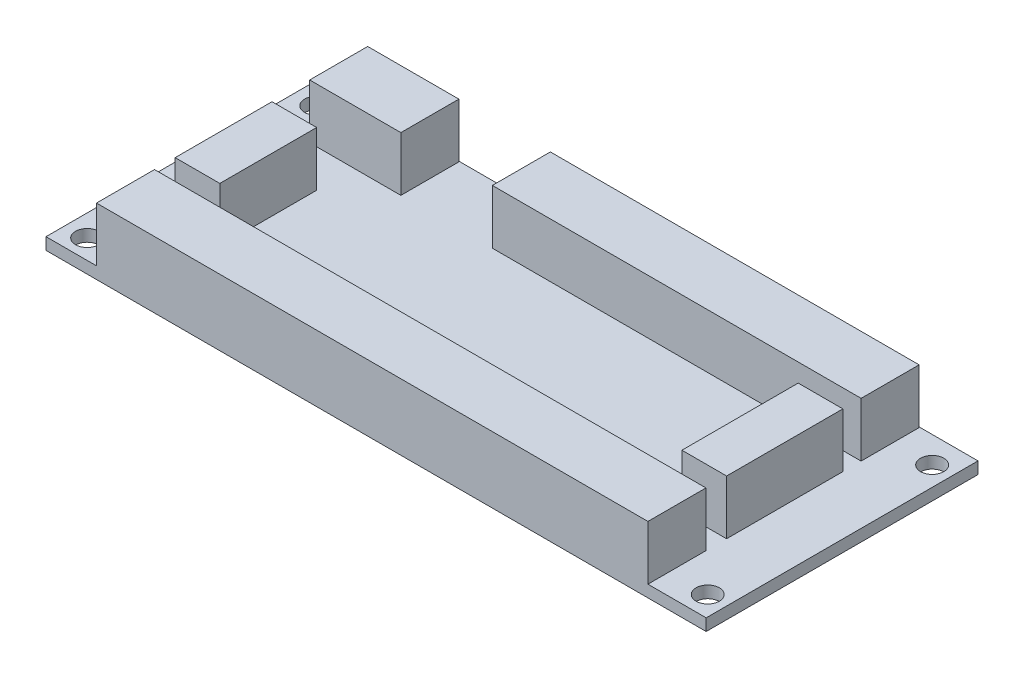
ISO-10303-21;
HEADER;
FILE_DESCRIPTION(('STEP AP214'),'2;1');
FILE_NAME('part.step','',(''),(''),'','','');
FILE_SCHEMA(('AUTOMOTIVE_DESIGN { 1 0 10303 214 1 1 1 1 }'));
ENDSEC;
DATA;
#1=APPLICATION_CONTEXT('core data for automotive mechanical design processes');
#2=APPLICATION_PROTOCOL_DEFINITION('international standard','automotive_design',2000,#1);
#3=PRODUCT_CONTEXT('',#1,'mechanical');
#4=PRODUCT('Part','Part','',(#3));
#5=PRODUCT_RELATED_PRODUCT_CATEGORY('part','',(#4));
#6=PRODUCT_DEFINITION_FORMATION('','',#4);
#7=PRODUCT_DEFINITION_CONTEXT('part definition',#1,'design');
#8=PRODUCT_DEFINITION('design','',#6,#7);
#9=PRODUCT_DEFINITION_SHAPE('','',#8);
#10=(LENGTH_UNIT() NAMED_UNIT(*) SI_UNIT(.MILLI.,.METRE.));
#11=(NAMED_UNIT(*) PLANE_ANGLE_UNIT() SI_UNIT($,.RADIAN.));
#12=(NAMED_UNIT(*) SI_UNIT($,.STERADIAN.) SOLID_ANGLE_UNIT());
#13=UNCERTAINTY_MEASURE_WITH_UNIT(LENGTH_MEASURE(1.E-05),#10,'distance_accuracy_value','');
#14=(GEOMETRIC_REPRESENTATION_CONTEXT(3) GLOBAL_UNCERTAINTY_ASSIGNED_CONTEXT((#13)) GLOBAL_UNIT_ASSIGNED_CONTEXT((#10,
#11,#12)) REPRESENTATION_CONTEXT('',''));
#15=CARTESIAN_POINT('',(0.,0.,0.));
#16=DIRECTION('',(0.,0.,1.));
#17=DIRECTION('',(1.,0.,0.));
#18=AXIS2_PLACEMENT_3D('',#15,#16,#17);
#19=CARTESIAN_POINT('',(0.,1.53,0.));
#20=DIRECTION('',(0.,-1.,0.));
#21=DIRECTION('',(0.,0.,-1.));
#22=AXIS2_PLACEMENT_3D('',#19,#20,#21);
#23=PLANE('',#22);
#24=DIRECTION('',(0.,0.,-1.));
#25=VECTOR('',#24,1.);
#26=CARTESIAN_POINT('',(-24.26,1.53,-17.42));
#27=LINE('',#26,#25);
#28=CARTESIAN_POINT('',(-24.26,1.53,-9.94999999999999));
#29=VERTEX_POINT('',#28);
#30=CARTESIAN_POINT('',(-24.26,1.53,-17.42));
#31=VERTEX_POINT('',#30);
#32=EDGE_CURVE('E216',#29,#31,#27,.T.);
#33=ORIENTED_EDGE('',*,*,#32,.F.);
#34=DIRECTION('',(1.,0.,0.));
#35=VECTOR('',#34,1.);
#36=CARTESIAN_POINT('',(-24.26,1.53,-9.94999999999999));
#37=LINE('',#36,#35);
#38=CARTESIAN_POINT('',(-36.,1.53,-9.94999999999999));
#39=VERTEX_POINT('',#38);
#40=EDGE_CURVE('E229',#39,#29,#37,.T.);
#41=ORIENTED_EDGE('',*,*,#40,.F.);
#42=DIRECTION('',(0.,0.,1.));
#43=VECTOR('',#42,1.);
#44=CARTESIAN_POINT('',(-36.,1.53,-17.42));
#45=LINE('',#44,#43);
#46=CARTESIAN_POINT('',(-36.,1.53,-17.42));
#47=VERTEX_POINT('',#46);
#48=EDGE_CURVE('E238',#47,#39,#45,.T.);
#49=ORIENTED_EDGE('',*,*,#48,.F.);
#50=DIRECTION('',(-1.,0.,0.));
#51=VECTOR('',#50,1.);
#52=CARTESIAN_POINT('',(-24.26,1.53,-17.42));
#53=LINE('',#52,#51);
#54=EDGE_CURVE('E219',#31,#47,#53,.T.);
#55=ORIENTED_EDGE('',*,*,#54,.F.);
#56=EDGE_LOOP('',(#33,#41,#49,#55));
#57=FACE_BOUND('',#56,.T.);
#58=DIRECTION('',(0.,0.,-1.));
#59=VECTOR('',#58,1.);
#60=CARTESIAN_POINT('',(35.,1.53,-17.42));
#61=LINE('',#60,#59);
#62=CARTESIAN_POINT('',(35.,1.53,-9.95));
#63=VERTEX_POINT('',#62);
#64=CARTESIAN_POINT('',(35.,1.53,-17.42));
#65=VERTEX_POINT('',#64);
#66=EDGE_CURVE('E287',#63,#65,#61,.T.);
#67=ORIENTED_EDGE('',*,*,#66,.F.);
#68=DIRECTION('',(1.,0.,0.));
#69=VECTOR('',#68,1.);
#70=CARTESIAN_POINT('',(35.,1.53,-9.95));
#71=LINE('',#70,#69);
#72=CARTESIAN_POINT('',(-12.48,1.53,-9.94999999999999));
#73=VERTEX_POINT('',#72);
#74=EDGE_CURVE('E292',#73,#63,#71,.T.);
#75=ORIENTED_EDGE('',*,*,#74,.F.);
#76=DIRECTION('',(0.,0.,1.));
#77=VECTOR('',#76,1.);
#78=CARTESIAN_POINT('',(-12.48,1.53,-17.42));
#79=LINE('',#78,#77);
#80=CARTESIAN_POINT('',(-12.48,1.53,-17.42));
#81=VERTEX_POINT('',#80);
#82=EDGE_CURVE('E304',#81,#73,#79,.T.);
#83=ORIENTED_EDGE('',*,*,#82,.F.);
#84=DIRECTION('',(-1.,0.,0.));
#85=VECTOR('',#84,1.);
#86=CARTESIAN_POINT('',(35.,1.53,-17.42));
#87=LINE('',#86,#85);
#88=EDGE_CURVE('E301',#65,#81,#87,.T.);
#89=ORIENTED_EDGE('',*,*,#88,.F.);
#90=EDGE_LOOP('',(#67,#75,#83,#89));
#91=FACE_BOUND('',#90,.T.);
#92=CARTESIAN_POINT('',(40.,1.53,14.8));
#93=DIRECTION('',(0.,1.,0.));
#94=DIRECTION('',(0.,0.,1.));
#95=AXIS2_PLACEMENT_3D('',#92,#93,#94);
#96=CIRCLE('',#95,1.5);
#97=CARTESIAN_POINT('',(40.,1.53,16.3));
#98=VERTEX_POINT('',#97);
#99=EDGE_CURVE('E351',#98,#98,#96,.T.);
#100=ORIENTED_EDGE('',*,*,#99,.F.);
#101=EDGE_LOOP('',(#100));
#102=FACE_BOUND('',#101,.T.);
#103=CARTESIAN_POINT('',(40.,1.53,-14.1));
#104=DIRECTION('',(0.,1.,0.));
#105=DIRECTION('',(0.,0.,1.));
#106=AXIS2_PLACEMENT_3D('',#103,#104,#105);
#107=CIRCLE('',#106,1.5);
#108=CARTESIAN_POINT('',(40.,1.53,-12.6));
#109=VERTEX_POINT('',#108);
#110=EDGE_CURVE('E357',#109,#109,#107,.T.);
#111=ORIENTED_EDGE('',*,*,#110,.F.);
#112=EDGE_LOOP('',(#111));
#113=FACE_BOUND('',#112,.T.);
#114=CARTESIAN_POINT('',(-39.7,1.53,15.));
#115=DIRECTION('',(0.,1.,0.));
#116=DIRECTION('',(0.,0.,1.));
#117=AXIS2_PLACEMENT_3D('',#114,#115,#116);
#118=CIRCLE('',#117,1.5);
#119=CARTESIAN_POINT('',(-39.7,1.53,16.5));
#120=VERTEX_POINT('',#119);
#121=EDGE_CURVE('E363',#120,#120,#118,.T.);
#122=ORIENTED_EDGE('',*,*,#121,.F.);
#123=EDGE_LOOP('',(#122));
#124=FACE_BOUND('',#123,.T.);
#125=CARTESIAN_POINT('',(-39.7,1.53,-14.5));
#126=DIRECTION('',(0.,1.,0.));
#127=DIRECTION('',(0.,0.,1.));
#128=AXIS2_PLACEMENT_3D('',#125,#126,#127);
#129=CIRCLE('',#128,1.5);
#130=CARTESIAN_POINT('',(-39.7,1.53,-13.));
#131=VERTEX_POINT('',#130);
#132=EDGE_CURVE('E369',#131,#131,#129,.T.);
#133=ORIENTED_EDGE('',*,*,#132,.F.);
#134=EDGE_LOOP('',(#133));
#135=FACE_BOUND('',#134,.T.);
#136=DIRECTION('',(0.,0.,1.));
#137=VECTOR('',#136,1.);
#138=CARTESIAN_POINT('',(-36.,1.53,17.5));
#139=LINE('',#138,#137);
#140=CARTESIAN_POINT('',(-36.,1.53,10.03));
#141=VERTEX_POINT('',#140);
#142=CARTESIAN_POINT('',(-36.,1.53,17.5));
#143=VERTEX_POINT('',#142);
#144=EDGE_CURVE('E320',#141,#143,#139,.T.);
#145=ORIENTED_EDGE('',*,*,#144,.F.);
#146=DIRECTION('',(-1.,0.,0.));
#147=VECTOR('',#146,1.);
#148=CARTESIAN_POINT('',(-36.,1.53,10.03));
#149=LINE('',#148,#147);
#150=CARTESIAN_POINT('',(35.,1.53,10.03));
#151=VERTEX_POINT('',#150);
#152=EDGE_CURVE('E325',#151,#141,#149,.T.);
#153=ORIENTED_EDGE('',*,*,#152,.F.);
#154=DIRECTION('',(0.,0.,-1.));
#155=VECTOR('',#154,1.);
#156=CARTESIAN_POINT('',(35.,1.53,17.5));
#157=LINE('',#156,#155);
#158=CARTESIAN_POINT('',(35.,1.53,17.5));
#159=VERTEX_POINT('',#158);
#160=EDGE_CURVE('E334',#159,#151,#157,.T.);
#161=ORIENTED_EDGE('',*,*,#160,.F.);
#162=DIRECTION('',(1.,0.,0.));
#163=VECTOR('',#162,1.);
#164=CARTESIAN_POINT('',(-42.5,1.53,17.5));
#165=LINE('',#164,#163);
#166=CARTESIAN_POINT('',(42.5,1.53,17.5));
#167=VERTEX_POINT('',#166);
#168=EDGE_CURVE('E383',#159,#167,#165,.T.);
#169=ORIENTED_EDGE('',*,*,#168,.T.);
#170=DIRECTION('',(0.,0.,-1.));
#171=VECTOR('',#170,1.);
#172=CARTESIAN_POINT('',(42.5,1.53,17.5));
#173=LINE('',#172,#171);
#174=CARTESIAN_POINT('',(42.5,1.53,-17.5));
#175=VERTEX_POINT('',#174);
#176=EDGE_CURVE('E375',#167,#175,#173,.T.);
#177=ORIENTED_EDGE('',*,*,#176,.T.);
#178=DIRECTION('',(-1.,0.,0.));
#179=VECTOR('',#178,1.);
#180=CARTESIAN_POINT('',(-42.5,1.53,-17.5));
#181=LINE('',#180,#179);
#182=CARTESIAN_POINT('',(-42.5,1.53,-17.5));
#183=VERTEX_POINT('',#182);
#184=EDGE_CURVE('E378',#175,#183,#181,.T.);
#185=ORIENTED_EDGE('',*,*,#184,.T.);
#186=DIRECTION('',(0.,0.,1.));
#187=VECTOR('',#186,1.);
#188=CARTESIAN_POINT('',(-42.5,1.53,17.5));
#189=LINE('',#188,#187);
#190=CARTESIAN_POINT('',(-42.5,1.53,17.5));
#191=VERTEX_POINT('',#190);
#192=EDGE_CURVE('E381',#183,#191,#189,.T.);
#193=ORIENTED_EDGE('',*,*,#192,.T.);
#194=EDGE_CURVE('E384',#191,#143,#165,.T.);
#195=ORIENTED_EDGE('',*,*,#194,.T.);
#196=EDGE_LOOP('',(#145,#153,#161,#169,#177,#185,#193,#195));
#197=FACE_BOUND('',#196,.T.);
#198=DIRECTION('',(0.,0.,-1.));
#199=VECTOR('',#198,1.);
#200=CARTESIAN_POINT('',(35.,1.53,7.37));
#201=LINE('',#200,#199);
#202=CARTESIAN_POINT('',(35.,1.53,7.37));
#203=VERTEX_POINT('',#202);
#204=CARTESIAN_POINT('',(35.,1.53,-7.6));
#205=VERTEX_POINT('',#204);
#206=EDGE_CURVE('E254',#203,#205,#201,.T.);
#207=ORIENTED_EDGE('',*,*,#206,.F.);
#208=DIRECTION('',(1.,0.,0.));
#209=VECTOR('',#208,1.);
#210=CARTESIAN_POINT('',(35.,1.53,7.37));
#211=LINE('',#210,#209);
#212=CARTESIAN_POINT('',(29.25,1.53,7.37));
#213=VERTEX_POINT('',#212);
#214=EDGE_CURVE('E259',#213,#203,#211,.T.);
#215=ORIENTED_EDGE('',*,*,#214,.F.);
#216=DIRECTION('',(0.,0.,1.));
#217=VECTOR('',#216,1.);
#218=CARTESIAN_POINT('',(29.25,1.53,7.37));
#219=LINE('',#218,#217);
#220=CARTESIAN_POINT('',(29.25,1.53,-7.6));
#221=VERTEX_POINT('',#220);
#222=EDGE_CURVE('E271',#221,#213,#219,.T.);
#223=ORIENTED_EDGE('',*,*,#222,.F.);
#224=DIRECTION('',(-1.,0.,0.));
#225=VECTOR('',#224,1.);
#226=CARTESIAN_POINT('',(35.,1.53,-7.6));
#227=LINE('',#226,#225);
#228=EDGE_CURVE('E268',#205,#221,#227,.T.);
#229=ORIENTED_EDGE('',*,*,#228,.F.);
#230=EDGE_LOOP('',(#207,#215,#223,#229));
#231=FACE_BOUND('',#230,.T.);
#232=DIRECTION('',(0.,0.,1.));
#233=VECTOR('',#232,1.);
#234=CARTESIAN_POINT('',(-36.,1.53,7.37));
#235=LINE('',#234,#233);
#236=CARTESIAN_POINT('',(-36.,1.53,-5.1));
#237=VERTEX_POINT('',#236);
#238=CARTESIAN_POINT('',(-36.,1.53,7.37));
#239=VERTEX_POINT('',#238);
#240=EDGE_CURVE('E215',#237,#239,#235,.T.);
#241=ORIENTED_EDGE('',*,*,#240,.F.);
#242=DIRECTION('',(-1.,0.,0.));
#243=VECTOR('',#242,1.);
#244=CARTESIAN_POINT('',(-36.,1.53,-5.1));
#245=LINE('',#244,#243);
#246=CARTESIAN_POINT('',(-30.25,1.53,-5.1));
#247=VERTEX_POINT('',#246);
#248=EDGE_CURVE('E212',#247,#237,#245,.T.);
#249=ORIENTED_EDGE('',*,*,#248,.F.);
#250=DIRECTION('',(0.,0.,-1.));
#251=VECTOR('',#250,1.);
#252=CARTESIAN_POINT('',(-30.25,1.53,7.37));
#253=LINE('',#252,#251);
#254=CARTESIAN_POINT('',(-30.25,1.53,7.37));
#255=VERTEX_POINT('',#254);
#256=EDGE_CURVE('E54',#255,#247,#253,.T.);
#257=ORIENTED_EDGE('',*,*,#256,.F.);
#258=DIRECTION('',(1.,0.,0.));
#259=VECTOR('',#258,1.);
#260=CARTESIAN_POINT('',(-36.,1.53,7.37));
#261=LINE('',#260,#259);
#262=EDGE_CURVE('E49',#239,#255,#261,.T.);
#263=ORIENTED_EDGE('',*,*,#262,.F.);
#264=EDGE_LOOP('',(#241,#249,#257,#263));
#265=FACE_BOUND('',#264,.T.);
#266=ADVANCED_FACE('F34',(#57,#91,#102,#113,#124,#135,#197,#231,#265),#23,.F.);
#267=CARTESIAN_POINT('',(0.,0.,0.));
#268=DIRECTION('',(0.,-1.,0.));
#269=DIRECTION('',(0.,0.,-1.));
#270=AXIS2_PLACEMENT_3D('',#267,#268,#269);
#271=PLANE('',#270);
#272=CARTESIAN_POINT('',(40.,0.,-14.1));
#273=DIRECTION('',(0.,1.,0.));
#274=DIRECTION('',(0.,0.,1.));
#275=AXIS2_PLACEMENT_3D('',#272,#273,#274);
#276=CIRCLE('',#275,1.5);
#277=CARTESIAN_POINT('',(40.,0.,-12.6));
#278=VERTEX_POINT('',#277);
#279=EDGE_CURVE('E354',#278,#278,#276,.T.);
#280=ORIENTED_EDGE('',*,*,#279,.T.);
#281=EDGE_LOOP('',(#280));
#282=FACE_BOUND('',#281,.T.);
#283=CARTESIAN_POINT('',(-39.7,0.,-14.5));
#284=DIRECTION('',(0.,1.,0.));
#285=DIRECTION('',(0.,0.,1.));
#286=AXIS2_PLACEMENT_3D('',#283,#284,#285);
#287=CIRCLE('',#286,1.5);
#288=CARTESIAN_POINT('',(-39.7,0.,-13.));
#289=VERTEX_POINT('',#288);
#290=EDGE_CURVE('E366',#289,#289,#287,.T.);
#291=ORIENTED_EDGE('',*,*,#290,.T.);
#292=EDGE_LOOP('',(#291));
#293=FACE_BOUND('',#292,.T.);
#294=DIRECTION('',(0.,0.,-1.));
#295=VECTOR('',#294,1.);
#296=CARTESIAN_POINT('',(42.5,0.,17.5));
#297=LINE('',#296,#295);
#298=CARTESIAN_POINT('',(42.5,0.,17.5));
#299=VERTEX_POINT('',#298);
#300=CARTESIAN_POINT('',(42.5,0.,-17.5));
#301=VERTEX_POINT('',#300);
#302=EDGE_CURVE('E372',#299,#301,#297,.T.);
#303=ORIENTED_EDGE('',*,*,#302,.F.);
#304=DIRECTION('',(1.,0.,0.));
#305=VECTOR('',#304,1.);
#306=CARTESIAN_POINT('',(-42.5,0.,17.5));
#307=LINE('',#306,#305);
#308=CARTESIAN_POINT('',(-42.5,0.,17.5));
#309=VERTEX_POINT('',#308);
#310=EDGE_CURVE('E379',#309,#299,#307,.T.);
#311=ORIENTED_EDGE('',*,*,#310,.F.);
#312=DIRECTION('',(0.,0.,1.));
#313=VECTOR('',#312,1.);
#314=CARTESIAN_POINT('',(-42.5,0.,17.5));
#315=LINE('',#314,#313);
#316=CARTESIAN_POINT('',(-42.5,0.,-17.5));
#317=VERTEX_POINT('',#316);
#318=EDGE_CURVE('E391',#317,#309,#315,.T.);
#319=ORIENTED_EDGE('',*,*,#318,.F.);
#320=DIRECTION('',(-1.,0.,0.));
#321=VECTOR('',#320,1.);
#322=CARTESIAN_POINT('',(-42.5,0.,-17.5));
#323=LINE('',#322,#321);
#324=EDGE_CURVE('E389',#301,#317,#323,.T.);
#325=ORIENTED_EDGE('',*,*,#324,.F.);
#326=EDGE_LOOP('',(#303,#311,#319,#325));
#327=FACE_BOUND('',#326,.T.);
#328=CARTESIAN_POINT('',(-39.7,0.,15.));
#329=DIRECTION('',(0.,1.,0.));
#330=DIRECTION('',(0.,0.,1.));
#331=AXIS2_PLACEMENT_3D('',#328,#329,#330);
#332=CIRCLE('',#331,1.5);
#333=CARTESIAN_POINT('',(-39.7,0.,16.5));
#334=VERTEX_POINT('',#333);
#335=EDGE_CURVE('E360',#334,#334,#332,.T.);
#336=ORIENTED_EDGE('',*,*,#335,.T.);
#337=EDGE_LOOP('',(#336));
#338=FACE_BOUND('',#337,.T.);
#339=CARTESIAN_POINT('',(40.,0.,14.8));
#340=DIRECTION('',(0.,1.,0.));
#341=DIRECTION('',(0.,0.,1.));
#342=AXIS2_PLACEMENT_3D('',#339,#340,#341);
#343=CIRCLE('',#342,1.5);
#344=CARTESIAN_POINT('',(40.,0.,16.3));
#345=VERTEX_POINT('',#344);
#346=EDGE_CURVE('E350',#345,#345,#343,.T.);
#347=ORIENTED_EDGE('',*,*,#346,.T.);
#348=EDGE_LOOP('',(#347));
#349=FACE_BOUND('',#348,.T.);
#350=ADVANCED_FACE('F409',(#282,#293,#327,#338,#349),#271,.T.);
#351=CARTESIAN_POINT('',(42.5,1.53,17.5));
#352=DIRECTION('',(-1.,0.,0.));
#353=DIRECTION('',(0.,0.,1.));
#354=AXIS2_PLACEMENT_3D('',#351,#352,#353);
#355=PLANE('',#354);
#356=ORIENTED_EDGE('',*,*,#302,.T.);
#357=DIRECTION('',(0.,-1.,0.));
#358=VECTOR('',#357,1.);
#359=CARTESIAN_POINT('',(42.5,1.53,-17.5));
#360=LINE('',#359,#358);
#361=EDGE_CURVE('E11',#175,#301,#360,.T.);
#362=ORIENTED_EDGE('',*,*,#361,.F.);
#363=ORIENTED_EDGE('',*,*,#176,.F.);
#364=DIRECTION('',(0.,-1.,0.));
#365=VECTOR('',#364,1.);
#366=CARTESIAN_POINT('',(42.5,1.53,17.5));
#367=LINE('',#366,#365);
#368=EDGE_CURVE('E386',#167,#299,#367,.T.);
#369=ORIENTED_EDGE('',*,*,#368,.T.);
#370=EDGE_LOOP('',(#356,#362,#363,#369));
#371=FACE_BOUND('',#370,.T.);
#372=ADVANCED_FACE('F36',(#371),#355,.F.);
#373=CARTESIAN_POINT('',(-42.5,1.53,-17.5));
#374=DIRECTION('',(0.,0.,1.));
#375=DIRECTION('',(1.,0.,0.));
#376=AXIS2_PLACEMENT_3D('',#373,#374,#375);
#377=PLANE('',#376);
#378=ORIENTED_EDGE('',*,*,#324,.T.);
#379=DIRECTION('',(0.,-1.,0.));
#380=VECTOR('',#379,1.);
#381=CARTESIAN_POINT('',(-42.5,1.53,-17.5));
#382=LINE('',#381,#380);
#383=EDGE_CURVE('E42',#183,#317,#382,.T.);
#384=ORIENTED_EDGE('',*,*,#383,.F.);
#385=ORIENTED_EDGE('',*,*,#184,.F.);
#386=ORIENTED_EDGE('',*,*,#361,.T.);
#387=EDGE_LOOP('',(#378,#384,#385,#386));
#388=FACE_BOUND('',#387,.T.);
#389=ADVANCED_FACE('F461',(#388),#377,.F.);
#390=CARTESIAN_POINT('',(-42.5,1.53,17.5));
#391=DIRECTION('',(1.,0.,0.));
#392=DIRECTION('',(0.,0.,-1.));
#393=AXIS2_PLACEMENT_3D('',#390,#391,#392);
#394=PLANE('',#393);
#395=ORIENTED_EDGE('',*,*,#318,.T.);
#396=DIRECTION('',(0.,-1.,0.));
#397=VECTOR('',#396,1.);
#398=CARTESIAN_POINT('',(-42.5,1.53,17.5));
#399=LINE('',#398,#397);
#400=EDGE_CURVE('E396',#191,#309,#399,.T.);
#401=ORIENTED_EDGE('',*,*,#400,.F.);
#402=ORIENTED_EDGE('',*,*,#192,.F.);
#403=ORIENTED_EDGE('',*,*,#383,.T.);
#404=EDGE_LOOP('',(#395,#401,#402,#403));
#405=FACE_BOUND('',#404,.T.);
#406=ADVANCED_FACE('F403',(#405),#394,.F.);
#407=CARTESIAN_POINT('',(-42.5,1.53,17.5));
#408=DIRECTION('',(0.,0.,-1.));
#409=DIRECTION('',(-1.,0.,0.));
#410=AXIS2_PLACEMENT_3D('',#407,#408,#409);
#411=PLANE('',#410);
#412=ORIENTED_EDGE('',*,*,#310,.T.);
#413=ORIENTED_EDGE('',*,*,#368,.F.);
#414=ORIENTED_EDGE('',*,*,#168,.F.);
#415=DIRECTION('',(0.,-1.,0.));
#416=VECTOR('',#415,1.);
#417=CARTESIAN_POINT('',(35.,8.53,17.5));
#418=LINE('',#417,#416);
#419=CARTESIAN_POINT('',(35.,8.53,17.5));
#420=VERTEX_POINT('',#419);
#421=EDGE_CURVE('E344',#420,#159,#418,.T.);
#422=ORIENTED_EDGE('',*,*,#421,.F.);
#423=DIRECTION('',(1.,0.,0.));
#424=VECTOR('',#423,1.);
#425=CARTESIAN_POINT('',(-36.,8.53,17.5));
#426=LINE('',#425,#424);
#427=CARTESIAN_POINT('',(-36.,8.53,17.5));
#428=VERTEX_POINT('',#427);
#429=EDGE_CURVE('E324',#428,#420,#426,.T.);
#430=ORIENTED_EDGE('',*,*,#429,.F.);
#431=DIRECTION('',(0.,-1.,0.));
#432=VECTOR('',#431,1.);
#433=CARTESIAN_POINT('',(-36.,8.53,17.5));
#434=LINE('',#433,#432);
#435=EDGE_CURVE('E347',#428,#143,#434,.T.);
#436=ORIENTED_EDGE('',*,*,#435,.T.);
#437=ORIENTED_EDGE('',*,*,#194,.F.);
#438=ORIENTED_EDGE('',*,*,#400,.T.);
#439=EDGE_LOOP('',(#412,#413,#414,#422,#430,#436,#437,#438));
#440=FACE_BOUND('',#439,.T.);
#441=ADVANCED_FACE('F413',(#440),#411,.F.);
#442=CARTESIAN_POINT('',(-39.7,1.53,-14.5));
#443=DIRECTION('',(0.,-1.,0.));
#444=DIRECTION('',(0.,0.,-1.));
#445=AXIS2_PLACEMENT_3D('',#442,#443,#444);
#446=CYLINDRICAL_SURFACE('',#445,1.5);
#447=ORIENTED_EDGE('',*,*,#132,.T.);
#448=EDGE_LOOP('',(#447));
#449=FACE_BOUND('',#448,.T.);
#450=ORIENTED_EDGE('',*,*,#290,.F.);
#451=EDGE_LOOP('',(#450));
#452=FACE_BOUND('',#451,.T.);
#453=ADVANCED_FACE('F455',(#449,#452),#446,.F.);
#454=CARTESIAN_POINT('',(-39.7,1.53,15.));
#455=DIRECTION('',(0.,-1.,0.));
#456=DIRECTION('',(0.,0.,-1.));
#457=AXIS2_PLACEMENT_3D('',#454,#455,#456);
#458=CYLINDRICAL_SURFACE('',#457,1.5);
#459=ORIENTED_EDGE('',*,*,#121,.T.);
#460=EDGE_LOOP('',(#459));
#461=FACE_BOUND('',#460,.T.);
#462=ORIENTED_EDGE('',*,*,#335,.F.);
#463=EDGE_LOOP('',(#462));
#464=FACE_BOUND('',#463,.T.);
#465=ADVANCED_FACE('F502',(#461,#464),#458,.F.);
#466=CARTESIAN_POINT('',(40.,1.53,-14.1));
#467=DIRECTION('',(0.,-1.,0.));
#468=DIRECTION('',(0.,0.,-1.));
#469=AXIS2_PLACEMENT_3D('',#466,#467,#468);
#470=CYLINDRICAL_SURFACE('',#469,1.5);
#471=ORIENTED_EDGE('',*,*,#110,.T.);
#472=EDGE_LOOP('',(#471));
#473=FACE_BOUND('',#472,.T.);
#474=ORIENTED_EDGE('',*,*,#279,.F.);
#475=EDGE_LOOP('',(#474));
#476=FACE_BOUND('',#475,.T.);
#477=ADVANCED_FACE('F510',(#473,#476),#470,.F.);
#478=CARTESIAN_POINT('',(40.,1.53,14.8));
#479=DIRECTION('',(0.,-1.,0.));
#480=DIRECTION('',(0.,0.,-1.));
#481=AXIS2_PLACEMENT_3D('',#478,#479,#480);
#482=CYLINDRICAL_SURFACE('',#481,1.5);
#483=ORIENTED_EDGE('',*,*,#99,.T.);
#484=EDGE_LOOP('',(#483));
#485=FACE_BOUND('',#484,.T.);
#486=ORIENTED_EDGE('',*,*,#346,.F.);
#487=EDGE_LOOP('',(#486));
#488=FACE_BOUND('',#487,.T.);
#489=ADVANCED_FACE('F518',(#485,#488),#482,.F.);
#490=CARTESIAN_POINT('',(-36.,8.53,17.5));
#491=DIRECTION('',(1.,0.,0.));
#492=DIRECTION('',(0.,0.,-1.));
#493=AXIS2_PLACEMENT_3D('',#490,#491,#492);
#494=PLANE('',#493);
#495=ORIENTED_EDGE('',*,*,#144,.T.);
#496=ORIENTED_EDGE('',*,*,#435,.F.);
#497=DIRECTION('',(0.,0.,1.));
#498=VECTOR('',#497,1.);
#499=CARTESIAN_POINT('',(-36.,8.53,17.5));
#500=LINE('',#499,#498);
#501=CARTESIAN_POINT('',(-36.,8.53,10.03));
#502=VERTEX_POINT('',#501);
#503=EDGE_CURVE('E321',#502,#428,#500,.T.);
#504=ORIENTED_EDGE('',*,*,#503,.F.);
#505=DIRECTION('',(0.,-1.,0.));
#506=VECTOR('',#505,1.);
#507=CARTESIAN_POINT('',(-36.,8.53,10.03));
#508=LINE('',#507,#506);
#509=EDGE_CURVE('E331',#502,#141,#508,.T.);
#510=ORIENTED_EDGE('',*,*,#509,.T.);
#511=EDGE_LOOP('',(#495,#496,#504,#510));
#512=FACE_BOUND('',#511,.T.);
#513=ADVANCED_FACE('F433',(#512),#494,.F.);
#514=CARTESIAN_POINT('',(35.,8.53,17.5));
#515=DIRECTION('',(-1.,0.,0.));
#516=DIRECTION('',(0.,0.,1.));
#517=AXIS2_PLACEMENT_3D('',#514,#515,#516);
#518=PLANE('',#517);
#519=ORIENTED_EDGE('',*,*,#160,.T.);
#520=DIRECTION('',(0.,-1.,0.));
#521=VECTOR('',#520,1.);
#522=CARTESIAN_POINT('',(35.,8.53,10.03));
#523=LINE('',#522,#521);
#524=CARTESIAN_POINT('',(35.,8.53,10.03));
#525=VERTEX_POINT('',#524);
#526=EDGE_CURVE('E341',#525,#151,#523,.T.);
#527=ORIENTED_EDGE('',*,*,#526,.F.);
#528=DIRECTION('',(0.,0.,-1.));
#529=VECTOR('',#528,1.);
#530=CARTESIAN_POINT('',(35.,8.53,17.5));
#531=LINE('',#530,#529);
#532=EDGE_CURVE('E327',#420,#525,#531,.T.);
#533=ORIENTED_EDGE('',*,*,#532,.F.);
#534=ORIENTED_EDGE('',*,*,#421,.T.);
#535=EDGE_LOOP('',(#519,#527,#533,#534));
#536=FACE_BOUND('',#535,.T.);
#537=ADVANCED_FACE('F424',(#536),#518,.F.);
#538=CARTESIAN_POINT('',(-36.,8.53,10.03));
#539=DIRECTION('',(0.,0.,1.));
#540=DIRECTION('',(1.,0.,0.));
#541=AXIS2_PLACEMENT_3D('',#538,#539,#540);
#542=PLANE('',#541);
#543=ORIENTED_EDGE('',*,*,#152,.T.);
#544=ORIENTED_EDGE('',*,*,#509,.F.);
#545=DIRECTION('',(-1.,0.,0.));
#546=VECTOR('',#545,1.);
#547=CARTESIAN_POINT('',(-36.,8.53,10.03));
#548=LINE('',#547,#546);
#549=EDGE_CURVE('E329',#525,#502,#548,.T.);
#550=ORIENTED_EDGE('',*,*,#549,.F.);
#551=ORIENTED_EDGE('',*,*,#526,.T.);
#552=EDGE_LOOP('',(#543,#544,#550,#551));
#553=FACE_BOUND('',#552,.T.);
#554=ADVANCED_FACE('F435',(#553),#542,.F.);
#555=CARTESIAN_POINT('',(0.,8.53,0.));
#556=DIRECTION('',(0.,-1.,0.));
#557=DIRECTION('',(0.,0.,-1.));
#558=AXIS2_PLACEMENT_3D('',#555,#556,#557);
#559=PLANE('',#558);
#560=ORIENTED_EDGE('',*,*,#503,.T.);
#561=ORIENTED_EDGE('',*,*,#429,.T.);
#562=ORIENTED_EDGE('',*,*,#532,.T.);
#563=ORIENTED_EDGE('',*,*,#549,.T.);
#564=EDGE_LOOP('',(#560,#561,#562,#563));
#565=FACE_BOUND('',#564,.T.);
#566=ADVANCED_FACE('F428',(#565),#559,.F.);
#567=CARTESIAN_POINT('',(35.,8.53,-17.42));
#568=DIRECTION('',(-1.,0.,0.));
#569=DIRECTION('',(0.,0.,1.));
#570=AXIS2_PLACEMENT_3D('',#567,#568,#569);
#571=PLANE('',#570);
#572=ORIENTED_EDGE('',*,*,#66,.T.);
#573=DIRECTION('',(0.,-1.,0.));
#574=VECTOR('',#573,1.);
#575=CARTESIAN_POINT('',(35.,8.53,-17.42));
#576=LINE('',#575,#574);
#577=CARTESIAN_POINT('',(35.,8.53,-17.42));
#578=VERTEX_POINT('',#577);
#579=EDGE_CURVE('E317',#578,#65,#576,.T.);
#580=ORIENTED_EDGE('',*,*,#579,.F.);
#581=DIRECTION('',(0.,0.,-1.));
#582=VECTOR('',#581,1.);
#583=CARTESIAN_POINT('',(35.,8.53,-17.42));
#584=LINE('',#583,#582);
#585=CARTESIAN_POINT('',(35.,8.53,-9.95));
#586=VERTEX_POINT('',#585);
#587=EDGE_CURVE('E288',#586,#578,#584,.T.);
#588=ORIENTED_EDGE('',*,*,#587,.F.);
#589=DIRECTION('',(0.,-1.,0.));
#590=VECTOR('',#589,1.);
#591=CARTESIAN_POINT('',(35.,8.53,-9.95));
#592=LINE('',#591,#590);
#593=EDGE_CURVE('E298',#586,#63,#592,.T.);
#594=ORIENTED_EDGE('',*,*,#593,.T.);
#595=EDGE_LOOP('',(#572,#580,#588,#594));
#596=FACE_BOUND('',#595,.T.);
#597=ADVANCED_FACE('F442',(#596),#571,.F.);
#598=CARTESIAN_POINT('',(35.,8.53,-17.42));
#599=DIRECTION('',(0.,0.,1.));
#600=DIRECTION('',(1.,0.,0.));
#601=AXIS2_PLACEMENT_3D('',#598,#599,#600);
#602=PLANE('',#601);
#603=ORIENTED_EDGE('',*,*,#88,.T.);
#604=DIRECTION('',(0.,-1.,0.));
#605=VECTOR('',#604,1.);
#606=CARTESIAN_POINT('',(-12.48,8.53,-17.42));
#607=LINE('',#606,#605);
#608=CARTESIAN_POINT('',(-12.48,8.53,-17.42));
#609=VERTEX_POINT('',#608);
#610=EDGE_CURVE('E314',#609,#81,#607,.T.);
#611=ORIENTED_EDGE('',*,*,#610,.F.);
#612=DIRECTION('',(-1.,0.,0.));
#613=VECTOR('',#612,1.);
#614=CARTESIAN_POINT('',(35.,8.53,-17.42));
#615=LINE('',#614,#613);
#616=EDGE_CURVE('E291',#578,#609,#615,.T.);
#617=ORIENTED_EDGE('',*,*,#616,.F.);
#618=ORIENTED_EDGE('',*,*,#579,.T.);
#619=EDGE_LOOP('',(#603,#611,#617,#618));
#620=FACE_BOUND('',#619,.T.);
#621=ADVANCED_FACE('F562',(#620),#602,.F.);
#622=CARTESIAN_POINT('',(-12.48,8.53,-17.42));
#623=DIRECTION('',(1.,0.,0.));
#624=DIRECTION('',(0.,0.,-1.));
#625=AXIS2_PLACEMENT_3D('',#622,#623,#624);
#626=PLANE('',#625);
#627=ORIENTED_EDGE('',*,*,#82,.T.);
#628=DIRECTION('',(0.,-1.,0.));
#629=VECTOR('',#628,1.);
#630=CARTESIAN_POINT('',(-12.48,8.53,-9.94999999999999));
#631=LINE('',#630,#629);
#632=CARTESIAN_POINT('',(-12.48,8.53,-9.94999999999999));
#633=VERTEX_POINT('',#632);
#634=EDGE_CURVE('E311',#633,#73,#631,.T.);
#635=ORIENTED_EDGE('',*,*,#634,.F.);
#636=DIRECTION('',(0.,0.,1.));
#637=VECTOR('',#636,1.);
#638=CARTESIAN_POINT('',(-12.48,8.53,-17.42));
#639=LINE('',#638,#637);
#640=EDGE_CURVE('E294',#609,#633,#639,.T.);
#641=ORIENTED_EDGE('',*,*,#640,.F.);
#642=ORIENTED_EDGE('',*,*,#610,.T.);
#643=EDGE_LOOP('',(#627,#635,#641,#642));
#644=FACE_BOUND('',#643,.T.);
#645=ADVANCED_FACE('F572',(#644),#626,.F.);
#646=CARTESIAN_POINT('',(35.,8.53,-9.95));
#647=DIRECTION('',(0.,0.,-1.));
#648=DIRECTION('',(-1.,0.,0.));
#649=AXIS2_PLACEMENT_3D('',#646,#647,#648);
#650=PLANE('',#649);
#651=ORIENTED_EDGE('',*,*,#74,.T.);
#652=ORIENTED_EDGE('',*,*,#593,.F.);
#653=DIRECTION('',(1.,0.,0.));
#654=VECTOR('',#653,1.);
#655=CARTESIAN_POINT('',(35.,8.53,-9.95));
#656=LINE('',#655,#654);
#657=EDGE_CURVE('E296',#633,#586,#656,.T.);
#658=ORIENTED_EDGE('',*,*,#657,.F.);
#659=ORIENTED_EDGE('',*,*,#634,.T.);
#660=EDGE_LOOP('',(#651,#652,#658,#659));
#661=FACE_BOUND('',#660,.T.);
#662=ADVANCED_FACE('F582',(#661),#650,.F.);
#663=CARTESIAN_POINT('',(0.,8.53,0.));
#664=DIRECTION('',(0.,-1.,0.));
#665=DIRECTION('',(0.,0.,-1.));
#666=AXIS2_PLACEMENT_3D('',#663,#664,#665);
#667=PLANE('',#666);
#668=ORIENTED_EDGE('',*,*,#587,.T.);
#669=ORIENTED_EDGE('',*,*,#616,.T.);
#670=ORIENTED_EDGE('',*,*,#640,.T.);
#671=ORIENTED_EDGE('',*,*,#657,.T.);
#672=EDGE_LOOP('',(#668,#669,#670,#671));
#673=FACE_BOUND('',#672,.T.);
#674=ADVANCED_FACE('F592',(#673),#667,.F.);
#675=CARTESIAN_POINT('',(35.,8.53,7.37));
#676=DIRECTION('',(-1.,0.,0.));
#677=DIRECTION('',(0.,0.,1.));
#678=AXIS2_PLACEMENT_3D('',#675,#676,#677);
#679=PLANE('',#678);
#680=ORIENTED_EDGE('',*,*,#206,.T.);
#681=DIRECTION('',(0.,-1.,0.));
#682=VECTOR('',#681,1.);
#683=CARTESIAN_POINT('',(35.,8.53,-7.6));
#684=LINE('',#683,#682);
#685=CARTESIAN_POINT('',(35.,8.53,-7.6));
#686=VERTEX_POINT('',#685);
#687=EDGE_CURVE('E284',#686,#205,#684,.T.);
#688=ORIENTED_EDGE('',*,*,#687,.F.);
#689=DIRECTION('',(0.,0.,-1.));
#690=VECTOR('',#689,1.);
#691=CARTESIAN_POINT('',(35.,8.53,7.37));
#692=LINE('',#691,#690);
#693=CARTESIAN_POINT('',(35.,8.53,7.37));
#694=VERTEX_POINT('',#693);
#695=EDGE_CURVE('E255',#694,#686,#692,.T.);
#696=ORIENTED_EDGE('',*,*,#695,.F.);
#697=DIRECTION('',(0.,-1.,0.));
#698=VECTOR('',#697,1.);
#699=CARTESIAN_POINT('',(35.,8.53,7.37));
#700=LINE('',#699,#698);
#701=EDGE_CURVE('E265',#694,#203,#700,.T.);
#702=ORIENTED_EDGE('',*,*,#701,.T.);
#703=EDGE_LOOP('',(#680,#688,#696,#702));
#704=FACE_BOUND('',#703,.T.);
#705=ADVANCED_FACE('F602',(#704),#679,.F.);
#706=CARTESIAN_POINT('',(35.,8.53,-7.6));
#707=DIRECTION('',(0.,0.,1.));
#708=DIRECTION('',(1.,0.,0.));
#709=AXIS2_PLACEMENT_3D('',#706,#707,#708);
#710=PLANE('',#709);
#711=ORIENTED_EDGE('',*,*,#228,.T.);
#712=DIRECTION('',(0.,-1.,0.));
#713=VECTOR('',#712,1.);
#714=CARTESIAN_POINT('',(29.25,8.53,-7.6));
#715=LINE('',#714,#713);
#716=CARTESIAN_POINT('',(29.25,8.53,-7.6));
#717=VERTEX_POINT('',#716);
#718=EDGE_CURVE('E281',#717,#221,#715,.T.);
#719=ORIENTED_EDGE('',*,*,#718,.F.);
#720=DIRECTION('',(-1.,0.,0.));
#721=VECTOR('',#720,1.);
#722=CARTESIAN_POINT('',(35.,8.53,-7.6));
#723=LINE('',#722,#721);
#724=EDGE_CURVE('E258',#686,#717,#723,.T.);
#725=ORIENTED_EDGE('',*,*,#724,.F.);
#726=ORIENTED_EDGE('',*,*,#687,.T.);
#727=EDGE_LOOP('',(#711,#719,#725,#726));
#728=FACE_BOUND('',#727,.T.);
#729=ADVANCED_FACE('F612',(#728),#710,.F.);
#730=CARTESIAN_POINT('',(29.25,8.53,7.37));
#731=DIRECTION('',(1.,0.,0.));
#732=DIRECTION('',(0.,0.,-1.));
#733=AXIS2_PLACEMENT_3D('',#730,#731,#732);
#734=PLANE('',#733);
#735=ORIENTED_EDGE('',*,*,#222,.T.);
#736=DIRECTION('',(0.,-1.,0.));
#737=VECTOR('',#736,1.);
#738=CARTESIAN_POINT('',(29.25,8.53,7.37));
#739=LINE('',#738,#737);
#740=CARTESIAN_POINT('',(29.25,8.53,7.37));
#741=VERTEX_POINT('',#740);
#742=EDGE_CURVE('E278',#741,#213,#739,.T.);
#743=ORIENTED_EDGE('',*,*,#742,.F.);
#744=DIRECTION('',(0.,0.,1.));
#745=VECTOR('',#744,1.);
#746=CARTESIAN_POINT('',(29.25,8.53,7.37));
#747=LINE('',#746,#745);
#748=EDGE_CURVE('E261',#717,#741,#747,.T.);
#749=ORIENTED_EDGE('',*,*,#748,.F.);
#750=ORIENTED_EDGE('',*,*,#718,.T.);
#751=EDGE_LOOP('',(#735,#743,#749,#750));
#752=FACE_BOUND('',#751,.T.);
#753=ADVANCED_FACE('F622',(#752),#734,.F.);
#754=CARTESIAN_POINT('',(35.,8.53,7.37));
#755=DIRECTION('',(0.,0.,-1.));
#756=DIRECTION('',(-1.,0.,0.));
#757=AXIS2_PLACEMENT_3D('',#754,#755,#756);
#758=PLANE('',#757);
#759=ORIENTED_EDGE('',*,*,#214,.T.);
#760=ORIENTED_EDGE('',*,*,#701,.F.);
#761=DIRECTION('',(1.,0.,0.));
#762=VECTOR('',#761,1.);
#763=CARTESIAN_POINT('',(35.,8.53,7.37));
#764=LINE('',#763,#762);
#765=EDGE_CURVE('E263',#741,#694,#764,.T.);
#766=ORIENTED_EDGE('',*,*,#765,.F.);
#767=ORIENTED_EDGE('',*,*,#742,.T.);
#768=EDGE_LOOP('',(#759,#760,#766,#767));
#769=FACE_BOUND('',#768,.T.);
#770=ADVANCED_FACE('F632',(#769),#758,.F.);
#771=CARTESIAN_POINT('',(0.,8.53,0.));
#772=DIRECTION('',(0.,1.,0.));
#773=DIRECTION('',(0.,0.,1.));
#774=AXIS2_PLACEMENT_3D('',#771,#772,#773);
#775=PLANE('',#774);
#776=ORIENTED_EDGE('',*,*,#695,.T.);
#777=ORIENTED_EDGE('',*,*,#724,.T.);
#778=ORIENTED_EDGE('',*,*,#748,.T.);
#779=ORIENTED_EDGE('',*,*,#765,.T.);
#780=EDGE_LOOP('',(#776,#777,#778,#779));
#781=FACE_BOUND('',#780,.T.);
#782=ADVANCED_FACE('F642',(#781),#775,.T.);
#783=CARTESIAN_POINT('',(-24.26,8.53,-17.42));
#784=DIRECTION('',(-1.,0.,0.));
#785=DIRECTION('',(0.,0.,1.));
#786=AXIS2_PLACEMENT_3D('',#783,#784,#785);
#787=PLANE('',#786);
#788=ORIENTED_EDGE('',*,*,#32,.T.);
#789=DIRECTION('',(0.,-1.,0.));
#790=VECTOR('',#789,1.);
#791=CARTESIAN_POINT('',(-24.26,8.53,-17.42));
#792=LINE('',#791,#790);
#793=CARTESIAN_POINT('',(-24.26,8.53,-17.42));
#794=VERTEX_POINT('',#793);
#795=EDGE_CURVE('E251',#794,#31,#792,.T.);
#796=ORIENTED_EDGE('',*,*,#795,.F.);
#797=DIRECTION('',(0.,0.,-1.));
#798=VECTOR('',#797,1.);
#799=CARTESIAN_POINT('',(-24.26,8.53,-17.42));
#800=LINE('',#799,#798);
#801=CARTESIAN_POINT('',(-24.26,8.53,-9.94999999999999));
#802=VERTEX_POINT('',#801);
#803=EDGE_CURVE('E225',#802,#794,#800,.T.);
#804=ORIENTED_EDGE('',*,*,#803,.F.);
#805=DIRECTION('',(0.,-1.,0.));
#806=VECTOR('',#805,1.);
#807=CARTESIAN_POINT('',(-24.26,8.53,-9.94999999999999));
#808=LINE('',#807,#806);
#809=EDGE_CURVE('E234',#802,#29,#808,.T.);
#810=ORIENTED_EDGE('',*,*,#809,.T.);
#811=EDGE_LOOP('',(#788,#796,#804,#810));
#812=FACE_BOUND('',#811,.T.);
#813=ADVANCED_FACE('F652',(#812),#787,.F.);
#814=CARTESIAN_POINT('',(-24.26,8.53,-17.42));
#815=DIRECTION('',(0.,0.,1.));
#816=DIRECTION('',(1.,0.,0.));
#817=AXIS2_PLACEMENT_3D('',#814,#815,#816);
#818=PLANE('',#817);
#819=ORIENTED_EDGE('',*,*,#54,.T.);
#820=DIRECTION('',(0.,-1.,0.));
#821=VECTOR('',#820,1.);
#822=CARTESIAN_POINT('',(-36.,8.53,-17.42));
#823=LINE('',#822,#821);
#824=CARTESIAN_POINT('',(-36.,8.53,-17.42));
#825=VERTEX_POINT('',#824);
#826=EDGE_CURVE('E248',#825,#47,#823,.T.);
#827=ORIENTED_EDGE('',*,*,#826,.F.);
#828=DIRECTION('',(-1.,0.,0.));
#829=VECTOR('',#828,1.);
#830=CARTESIAN_POINT('',(-24.26,8.53,-17.42));
#831=LINE('',#830,#829);
#832=EDGE_CURVE('E228',#794,#825,#831,.T.);
#833=ORIENTED_EDGE('',*,*,#832,.F.);
#834=ORIENTED_EDGE('',*,*,#795,.T.);
#835=EDGE_LOOP('',(#819,#827,#833,#834));
#836=FACE_BOUND('',#835,.T.);
#837=ADVANCED_FACE('F662',(#836),#818,.F.);
#838=CARTESIAN_POINT('',(-36.,8.53,-17.42));
#839=DIRECTION('',(1.,0.,0.));
#840=DIRECTION('',(0.,0.,-1.));
#841=AXIS2_PLACEMENT_3D('',#838,#839,#840);
#842=PLANE('',#841);
#843=ORIENTED_EDGE('',*,*,#48,.T.);
#844=DIRECTION('',(0.,-1.,0.));
#845=VECTOR('',#844,1.);
#846=CARTESIAN_POINT('',(-36.,8.53,-9.94999999999999));
#847=LINE('',#846,#845);
#848=CARTESIAN_POINT('',(-36.,8.53,-9.94999999999999));
#849=VERTEX_POINT('',#848);
#850=EDGE_CURVE('E245',#849,#39,#847,.T.);
#851=ORIENTED_EDGE('',*,*,#850,.F.);
#852=DIRECTION('',(0.,0.,1.));
#853=VECTOR('',#852,1.);
#854=CARTESIAN_POINT('',(-36.,8.53,-17.42));
#855=LINE('',#854,#853);
#856=EDGE_CURVE('E231',#825,#849,#855,.T.);
#857=ORIENTED_EDGE('',*,*,#856,.F.);
#858=ORIENTED_EDGE('',*,*,#826,.T.);
#859=EDGE_LOOP('',(#843,#851,#857,#858));
#860=FACE_BOUND('',#859,.T.);
#861=ADVANCED_FACE('F672',(#860),#842,.F.);
#862=CARTESIAN_POINT('',(-24.26,8.53,-9.94999999999999));
#863=DIRECTION('',(0.,0.,-1.));
#864=DIRECTION('',(-1.,0.,0.));
#865=AXIS2_PLACEMENT_3D('',#862,#863,#864);
#866=PLANE('',#865);
#867=ORIENTED_EDGE('',*,*,#40,.T.);
#868=ORIENTED_EDGE('',*,*,#809,.F.);
#869=DIRECTION('',(1.,0.,0.));
#870=VECTOR('',#869,1.);
#871=CARTESIAN_POINT('',(-24.26,8.53,-9.94999999999999));
#872=LINE('',#871,#870);
#873=EDGE_CURVE('E233',#849,#802,#872,.T.);
#874=ORIENTED_EDGE('',*,*,#873,.F.);
#875=ORIENTED_EDGE('',*,*,#850,.T.);
#876=EDGE_LOOP('',(#867,#868,#874,#875));
#877=FACE_BOUND('',#876,.T.);
#878=ADVANCED_FACE('F682',(#877),#866,.F.);
#879=CARTESIAN_POINT('',(0.,8.53,0.));
#880=DIRECTION('',(0.,-1.,0.));
#881=DIRECTION('',(0.,0.,-1.));
#882=AXIS2_PLACEMENT_3D('',#879,#880,#881);
#883=PLANE('',#882);
#884=ORIENTED_EDGE('',*,*,#803,.T.);
#885=ORIENTED_EDGE('',*,*,#832,.T.);
#886=ORIENTED_EDGE('',*,*,#856,.T.);
#887=ORIENTED_EDGE('',*,*,#873,.T.);
#888=EDGE_LOOP('',(#884,#885,#886,#887));
#889=FACE_BOUND('',#888,.T.);
#890=ADVANCED_FACE('F692',(#889),#883,.F.);
#891=CARTESIAN_POINT('',(-36.,8.53,7.37));
#892=DIRECTION('',(1.,0.,0.));
#893=DIRECTION('',(0.,0.,-1.));
#894=AXIS2_PLACEMENT_3D('',#891,#892,#893);
#895=PLANE('',#894);
#896=ORIENTED_EDGE('',*,*,#240,.T.);
#897=DIRECTION('',(0.,-1.,0.));
#898=VECTOR('',#897,1.);
#899=CARTESIAN_POINT('',(-36.,8.53,7.37));
#900=LINE('',#899,#898);
#901=CARTESIAN_POINT('',(-36.,8.53,7.37));
#902=VERTEX_POINT('',#901);
#903=EDGE_CURVE('E196',#902,#239,#900,.T.);
#904=ORIENTED_EDGE('',*,*,#903,.F.);
#905=DIRECTION('',(0.,0.,1.));
#906=VECTOR('',#905,1.);
#907=CARTESIAN_POINT('',(-36.,8.53,7.37));
#908=LINE('',#907,#906);
#909=CARTESIAN_POINT('',(-36.,8.53,-5.1));
#910=VERTEX_POINT('',#909);
#911=EDGE_CURVE('E203',#910,#902,#908,.T.);
#912=ORIENTED_EDGE('',*,*,#911,.F.);
#913=DIRECTION('',(0.,-1.,0.));
#914=VECTOR('',#913,1.);
#915=CARTESIAN_POINT('',(-36.,8.53,-5.1));
#916=LINE('',#915,#914);
#917=EDGE_CURVE('E752',#910,#237,#916,.T.);
#918=ORIENTED_EDGE('',*,*,#917,.T.);
#919=EDGE_LOOP('',(#896,#904,#912,#918));
#920=FACE_BOUND('',#919,.T.);
#921=ADVANCED_FACE('F214',(#920),#895,.F.);
#922=CARTESIAN_POINT('',(-36.,8.53,7.37));
#923=DIRECTION('',(0.,0.,-1.));
#924=DIRECTION('',(-1.,0.,0.));
#925=AXIS2_PLACEMENT_3D('',#922,#923,#924);
#926=PLANE('',#925);
#927=ORIENTED_EDGE('',*,*,#262,.T.);
#928=DIRECTION('',(0.,-1.,0.));
#929=VECTOR('',#928,1.);
#930=CARTESIAN_POINT('',(-30.25,8.53,7.37));
#931=LINE('',#930,#929);
#932=CARTESIAN_POINT('',(-30.25,8.53,7.37));
#933=VERTEX_POINT('',#932);
#934=EDGE_CURVE('E199',#933,#255,#931,.T.);
#935=ORIENTED_EDGE('',*,*,#934,.F.);
#936=DIRECTION('',(1.,0.,0.));
#937=VECTOR('',#936,1.);
#938=CARTESIAN_POINT('',(-36.,8.53,7.37));
#939=LINE('',#938,#937);
#940=EDGE_CURVE('E192',#902,#933,#939,.T.);
#941=ORIENTED_EDGE('',*,*,#940,.F.);
#942=ORIENTED_EDGE('',*,*,#903,.T.);
#943=EDGE_LOOP('',(#927,#935,#941,#942));
#944=FACE_BOUND('',#943,.T.);
#945=ADVANCED_FACE('F194',(#944),#926,.F.);
#946=CARTESIAN_POINT('',(-30.25,8.53,7.37));
#947=DIRECTION('',(-1.,0.,0.));
#948=DIRECTION('',(0.,0.,1.));
#949=AXIS2_PLACEMENT_3D('',#946,#947,#948);
#950=PLANE('',#949);
#951=ORIENTED_EDGE('',*,*,#256,.T.);
#952=DIRECTION('',(0.,-1.,0.));
#953=VECTOR('',#952,1.);
#954=CARTESIAN_POINT('',(-30.25,8.53,-5.1));
#955=LINE('',#954,#953);
#956=CARTESIAN_POINT('',(-30.25,8.53,-5.1));
#957=VERTEX_POINT('',#956);
#958=EDGE_CURVE('E221',#957,#247,#955,.T.);
#959=ORIENTED_EDGE('',*,*,#958,.F.);
#960=DIRECTION('',(0.,0.,-1.));
#961=VECTOR('',#960,1.);
#962=CARTESIAN_POINT('',(-30.25,8.53,7.37));
#963=LINE('',#962,#961);
#964=EDGE_CURVE('E202',#933,#957,#963,.T.);
#965=ORIENTED_EDGE('',*,*,#964,.F.);
#966=ORIENTED_EDGE('',*,*,#934,.T.);
#967=EDGE_LOOP('',(#951,#959,#965,#966));
#968=FACE_BOUND('',#967,.T.);
#969=ADVANCED_FACE('F719',(#968),#950,.F.);
#970=CARTESIAN_POINT('',(-36.,8.53,-5.1));
#971=DIRECTION('',(0.,0.,1.));
#972=DIRECTION('',(1.,0.,0.));
#973=AXIS2_PLACEMENT_3D('',#970,#971,#972);
#974=PLANE('',#973);
#975=ORIENTED_EDGE('',*,*,#248,.T.);
#976=ORIENTED_EDGE('',*,*,#917,.F.);
#977=DIRECTION('',(-1.,0.,0.));
#978=VECTOR('',#977,1.);
#979=CARTESIAN_POINT('',(-36.,8.53,-5.1));
#980=LINE('',#979,#978);
#981=EDGE_CURVE('E208',#957,#910,#980,.T.);
#982=ORIENTED_EDGE('',*,*,#981,.F.);
#983=ORIENTED_EDGE('',*,*,#958,.T.);
#984=EDGE_LOOP('',(#975,#976,#982,#983));
#985=FACE_BOUND('',#984,.T.);
#986=ADVANCED_FACE('F728',(#985),#974,.F.);
#987=CARTESIAN_POINT('',(0.,8.53,0.));
#988=DIRECTION('',(0.,-1.,0.));
#989=DIRECTION('',(0.,0.,-1.));
#990=AXIS2_PLACEMENT_3D('',#987,#988,#989);
#991=PLANE('',#990);
#992=ORIENTED_EDGE('',*,*,#911,.T.);
#993=ORIENTED_EDGE('',*,*,#940,.T.);
#994=ORIENTED_EDGE('',*,*,#964,.T.);
#995=ORIENTED_EDGE('',*,*,#981,.T.);
#996=EDGE_LOOP('',(#992,#993,#994,#995));
#997=FACE_BOUND('',#996,.T.);
#998=ADVANCED_FACE('F206',(#997),#991,.F.);
#999=CLOSED_SHELL('',(#266,#350,#372,#389,#406,#441,#453,#465,#477,#489,#513,#537,#554,#566,
#597,#621,#645,#662,#674,#705,#729,#753,#770,#782,#813,#837,#861,#878,#890,#921,#945,#969,#986,#998));
#1000=MANIFOLD_SOLID_BREP('B2',#999);
#1001=ADVANCED_BREP_SHAPE_REPRESENTATION('',(#18,#1000),#14);
#1002=SHAPE_DEFINITION_REPRESENTATION(#9,#1001);
ENDSEC;
END-ISO-10303-21;
